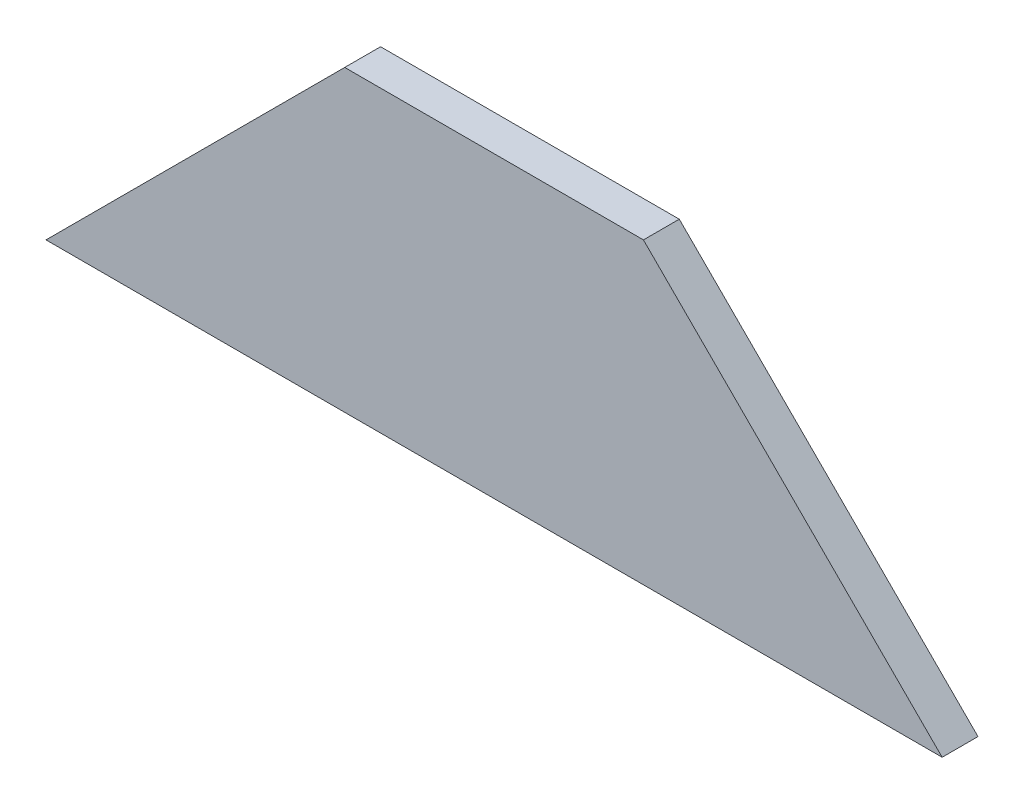
ISO-10303-21;
HEADER;
FILE_DESCRIPTION(('STEP AP214'),'2;1');
FILE_NAME('part.step','',(''),(''),'','','');
FILE_SCHEMA(('AUTOMOTIVE_DESIGN { 1 0 10303 214 1 1 1 1 }'));
ENDSEC;
DATA;
#1=APPLICATION_CONTEXT('core data for automotive mechanical design processes');
#2=APPLICATION_PROTOCOL_DEFINITION('international standard','automotive_design',2000,#1);
#3=PRODUCT_CONTEXT('',#1,'mechanical');
#4=PRODUCT('Part','Part','',(#3));
#5=PRODUCT_RELATED_PRODUCT_CATEGORY('part','',(#4));
#6=PRODUCT_DEFINITION_FORMATION('','',#4);
#7=PRODUCT_DEFINITION_CONTEXT('part definition',#1,'design');
#8=PRODUCT_DEFINITION('design','',#6,#7);
#9=PRODUCT_DEFINITION_SHAPE('','',#8);
#10=(LENGTH_UNIT() NAMED_UNIT(*) SI_UNIT(.MILLI.,.METRE.));
#11=(NAMED_UNIT(*) PLANE_ANGLE_UNIT() SI_UNIT($,.RADIAN.));
#12=(NAMED_UNIT(*) SI_UNIT($,.STERADIAN.) SOLID_ANGLE_UNIT());
#13=UNCERTAINTY_MEASURE_WITH_UNIT(LENGTH_MEASURE(1.E-05),#10,'distance_accuracy_value','');
#14=(GEOMETRIC_REPRESENTATION_CONTEXT(3) GLOBAL_UNCERTAINTY_ASSIGNED_CONTEXT((#13)) GLOBAL_UNIT_ASSIGNED_CONTEXT((#10,
#11,#12)) REPRESENTATION_CONTEXT('',''));
#15=CARTESIAN_POINT('',(0.,0.,0.));
#16=DIRECTION('',(0.,0.,1.));
#17=DIRECTION('',(1.,0.,0.));
#18=AXIS2_PLACEMENT_3D('',#15,#16,#17);
#19=CARTESIAN_POINT('',(-150.,0.,6.));
#20=DIRECTION('',(0.,1.,0.));
#21=DIRECTION('',(0.,0.,1.));
#22=AXIS2_PLACEMENT_3D('',#19,#20,#21);
#23=PLANE('',#22);
#24=DIRECTION('',(1.,0.,0.));
#25=VECTOR('',#24,1.);
#26=CARTESIAN_POINT('',(-150.,0.,0.));
#27=LINE('',#26,#25);
#28=CARTESIAN_POINT('',(-150.,0.,0.));
#29=VERTEX_POINT('',#28);
#30=CARTESIAN_POINT('',(0.,0.,0.));
#31=VERTEX_POINT('',#30);
#32=EDGE_CURVE('E70',#29,#31,#27,.T.);
#33=ORIENTED_EDGE('',*,*,#32,.T.);
#34=DIRECTION('',(0.,0.,-1.));
#35=VECTOR('',#34,1.);
#36=CARTESIAN_POINT('',(0.,0.,6.));
#37=LINE('',#36,#35);
#38=CARTESIAN_POINT('',(0.,0.,6.));
#39=VERTEX_POINT('',#38);
#40=EDGE_CURVE('E11',#39,#31,#37,.T.);
#41=ORIENTED_EDGE('',*,*,#40,.F.);
#42=DIRECTION('',(1.,0.,0.));
#43=VECTOR('',#42,1.);
#44=CARTESIAN_POINT('',(-150.,0.,6.));
#45=LINE('',#44,#43);
#46=CARTESIAN_POINT('',(-150.,0.,6.));
#47=VERTEX_POINT('',#46);
#48=EDGE_CURVE('E88',#47,#39,#45,.T.);
#49=ORIENTED_EDGE('',*,*,#48,.F.);
#50=DIRECTION('',(0.,0.,-1.));
#51=VECTOR('',#50,1.);
#52=CARTESIAN_POINT('',(-150.,0.,6.));
#53=LINE('',#52,#51);
#54=EDGE_CURVE('E82',#47,#29,#53,.T.);
#55=ORIENTED_EDGE('',*,*,#54,.T.);
#56=EDGE_LOOP('',(#33,#41,#49,#55));
#57=FACE_BOUND('',#56,.T.);
#58=ADVANCED_FACE('F26',(#57),#23,.F.);
#59=CARTESIAN_POINT('',(0.,0.,6.));
#60=DIRECTION('',(-0.707106781186546,-0.707106781186549,0.));
#61=DIRECTION('',(0.707106781186549,-0.707106781186546,0.));
#62=AXIS2_PLACEMENT_3D('',#59,#60,#61);
#63=PLANE('',#62);
#64=DIRECTION('',(-0.707106781186549,0.707106781186546,0.));
#65=VECTOR('',#64,1.);
#66=CARTESIAN_POINT('',(0.,0.,0.));
#67=LINE('',#66,#65);
#68=CARTESIAN_POINT('',(-50.0000000000002,50.,0.));
#69=VERTEX_POINT('',#68);
#70=EDGE_CURVE('E66',#31,#69,#67,.T.);
#71=ORIENTED_EDGE('',*,*,#70,.T.);
#72=DIRECTION('',(0.,0.,-1.));
#73=VECTOR('',#72,1.);
#74=CARTESIAN_POINT('',(-50.0000000000002,50.,6.));
#75=LINE('',#74,#73);
#76=CARTESIAN_POINT('',(-50.0000000000002,50.,6.));
#77=VERTEX_POINT('',#76);
#78=EDGE_CURVE('E33',#77,#69,#75,.T.);
#79=ORIENTED_EDGE('',*,*,#78,.F.);
#80=DIRECTION('',(-0.707106781186549,0.707106781186546,0.));
#81=VECTOR('',#80,1.);
#82=CARTESIAN_POINT('',(0.,0.,6.));
#83=LINE('',#82,#81);
#84=EDGE_CURVE('E78',#39,#77,#83,.T.);
#85=ORIENTED_EDGE('',*,*,#84,.F.);
#86=ORIENTED_EDGE('',*,*,#40,.T.);
#87=EDGE_LOOP('',(#71,#79,#85,#86));
#88=FACE_BOUND('',#87,.T.);
#89=ADVANCED_FACE('F77',(#88),#63,.F.);
#90=CARTESIAN_POINT('',(-100.,50.,6.));
#91=DIRECTION('',(0.,-1.,0.));
#92=DIRECTION('',(1.,0.,0.));
#93=AXIS2_PLACEMENT_3D('',#90,#91,#92);
#94=PLANE('',#93);
#95=DIRECTION('',(-1.,0.,0.));
#96=VECTOR('',#95,1.);
#97=CARTESIAN_POINT('',(-100.,50.,0.));
#98=LINE('',#97,#96);
#99=CARTESIAN_POINT('',(-100.,50.,0.));
#100=VERTEX_POINT('',#99);
#101=EDGE_CURVE('E71',#69,#100,#98,.T.);
#102=ORIENTED_EDGE('',*,*,#101,.T.);
#103=DIRECTION('',(0.,0.,-1.));
#104=VECTOR('',#103,1.);
#105=CARTESIAN_POINT('',(-100.,50.,6.));
#106=LINE('',#105,#104);
#107=CARTESIAN_POINT('',(-100.,50.,6.));
#108=VERTEX_POINT('',#107);
#109=EDGE_CURVE('E94',#108,#100,#106,.T.);
#110=ORIENTED_EDGE('',*,*,#109,.F.);
#111=DIRECTION('',(-1.,0.,0.));
#112=VECTOR('',#111,1.);
#113=CARTESIAN_POINT('',(-100.,50.,6.));
#114=LINE('',#113,#112);
#115=EDGE_CURVE('E45',#77,#108,#114,.T.);
#116=ORIENTED_EDGE('',*,*,#115,.F.);
#117=ORIENTED_EDGE('',*,*,#78,.T.);
#118=EDGE_LOOP('',(#102,#110,#116,#117));
#119=FACE_BOUND('',#118,.T.);
#120=ADVANCED_FACE('F97',(#119),#94,.F.);
#121=CARTESIAN_POINT('',(-150.,0.,6.));
#122=DIRECTION('',(0.707106781186549,-0.707106781186546,0.));
#123=DIRECTION('',(0.707106781186546,0.707106781186549,0.));
#124=AXIS2_PLACEMENT_3D('',#121,#122,#123);
#125=PLANE('',#124);
#126=DIRECTION('',(-0.707106781186546,-0.707106781186549,0.));
#127=VECTOR('',#126,1.);
#128=CARTESIAN_POINT('',(-150.,0.,0.));
#129=LINE('',#128,#127);
#130=EDGE_CURVE('E86',#100,#29,#129,.T.);
#131=ORIENTED_EDGE('',*,*,#130,.T.);
#132=ORIENTED_EDGE('',*,*,#54,.F.);
#133=DIRECTION('',(-0.707106781186546,-0.707106781186549,0.));
#134=VECTOR('',#133,1.);
#135=CARTESIAN_POINT('',(-150.,0.,6.));
#136=LINE('',#135,#134);
#137=EDGE_CURVE('E40',#108,#47,#136,.T.);
#138=ORIENTED_EDGE('',*,*,#137,.F.);
#139=ORIENTED_EDGE('',*,*,#109,.T.);
#140=EDGE_LOOP('',(#131,#132,#138,#139));
#141=FACE_BOUND('',#140,.T.);
#142=ADVANCED_FACE('F99',(#141),#125,.F.);
#143=CARTESIAN_POINT('',(-150.,0.,6.));
#144=DIRECTION('',(0.,0.,1.));
#145=DIRECTION('',(1.,0.,0.));
#146=AXIS2_PLACEMENT_3D('',#143,#144,#145);
#147=PLANE('',#146);
#148=ORIENTED_EDGE('',*,*,#48,.T.);
#149=ORIENTED_EDGE('',*,*,#84,.T.);
#150=ORIENTED_EDGE('',*,*,#115,.T.);
#151=ORIENTED_EDGE('',*,*,#137,.T.);
#152=EDGE_LOOP('',(#148,#149,#150,#151));
#153=FACE_BOUND('',#152,.T.);
#154=ADVANCED_FACE('F100',(#153),#147,.T.);
#155=CARTESIAN_POINT('',(-150.,0.,0.));
#156=DIRECTION('',(0.,0.,1.));
#157=DIRECTION('',(1.,0.,0.));
#158=AXIS2_PLACEMENT_3D('',#155,#156,#157);
#159=PLANE('',#158);
#160=ORIENTED_EDGE('',*,*,#32,.F.);
#161=ORIENTED_EDGE('',*,*,#130,.F.);
#162=ORIENTED_EDGE('',*,*,#101,.F.);
#163=ORIENTED_EDGE('',*,*,#70,.F.);
#164=EDGE_LOOP('',(#160,#161,#162,#163));
#165=FACE_BOUND('',#164,.T.);
#166=ADVANCED_FACE('F67',(#165),#159,.F.);
#167=CLOSED_SHELL('',(#58,#89,#120,#142,#154,#166));
#168=MANIFOLD_SOLID_BREP('B2',#167);
#169=ADVANCED_BREP_SHAPE_REPRESENTATION('',(#18,#168),#14);
#170=SHAPE_DEFINITION_REPRESENTATION(#9,#169);
ENDSEC;
END-ISO-10303-21;
